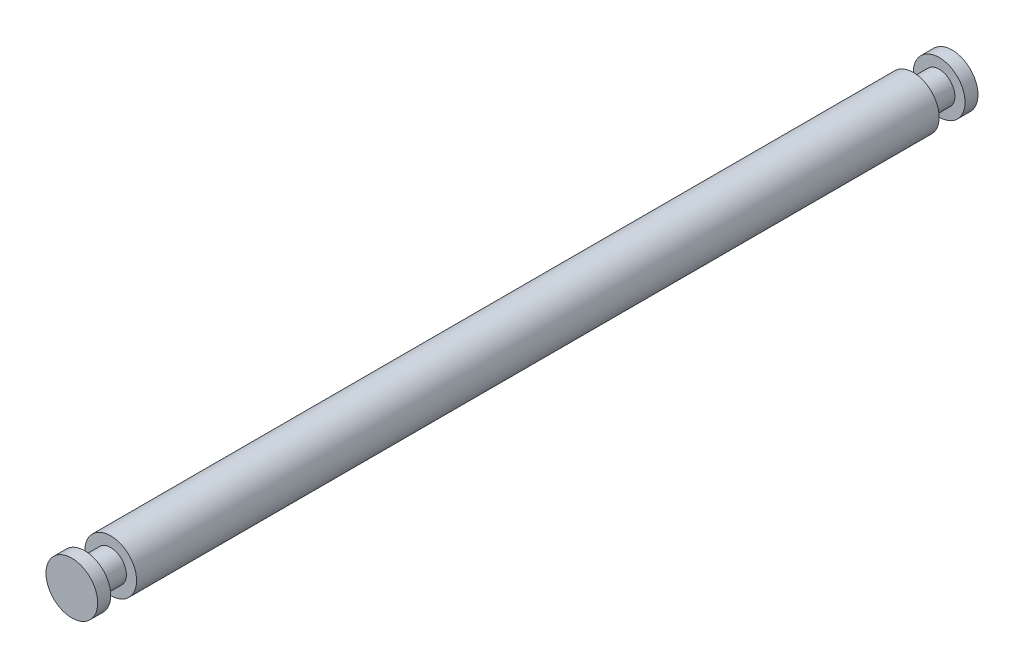
ISO-10303-21;
HEADER;
FILE_DESCRIPTION(('STEP AP214'),'2;1');
FILE_NAME('part.step','',(''),(''),'','','');
FILE_SCHEMA(('AUTOMOTIVE_DESIGN { 1 0 10303 214 1 1 1 1 }'));
ENDSEC;
DATA;
#1=APPLICATION_CONTEXT('core data for automotive mechanical design processes');
#2=APPLICATION_PROTOCOL_DEFINITION('international standard','automotive_design',2000,#1);
#3=PRODUCT_CONTEXT('',#1,'mechanical');
#4=PRODUCT('Part','Part','',(#3));
#5=PRODUCT_RELATED_PRODUCT_CATEGORY('part','',(#4));
#6=PRODUCT_DEFINITION_FORMATION('','',#4);
#7=PRODUCT_DEFINITION_CONTEXT('part definition',#1,'design');
#8=PRODUCT_DEFINITION('design','',#6,#7);
#9=PRODUCT_DEFINITION_SHAPE('','',#8);
#10=(LENGTH_UNIT() NAMED_UNIT(*) SI_UNIT(.MILLI.,.METRE.));
#11=(NAMED_UNIT(*) PLANE_ANGLE_UNIT() SI_UNIT($,.RADIAN.));
#12=(NAMED_UNIT(*) SI_UNIT($,.STERADIAN.) SOLID_ANGLE_UNIT());
#13=UNCERTAINTY_MEASURE_WITH_UNIT(LENGTH_MEASURE(1.E-05),#10,'distance_accuracy_value','');
#14=(GEOMETRIC_REPRESENTATION_CONTEXT(3) GLOBAL_UNCERTAINTY_ASSIGNED_CONTEXT((#13)) GLOBAL_UNIT_ASSIGNED_CONTEXT((#10,
#11,#12)) REPRESENTATION_CONTEXT('',''));
#15=CARTESIAN_POINT('',(0.,0.,0.));
#16=DIRECTION('',(0.,0.,1.));
#17=DIRECTION('',(1.,0.,0.));
#18=AXIS2_PLACEMENT_3D('',#15,#16,#17);
#19=CARTESIAN_POINT('',(0.,0.,0.));
#20=DIRECTION('',(0.,0.,1.));
#21=DIRECTION('',(1.,0.,0.));
#22=AXIS2_PLACEMENT_3D('',#19,#20,#21);
#23=CYLINDRICAL_SURFACE('',#22,1.27);
#24=CARTESIAN_POINT('',(0.,0.,-0.635));
#25=DIRECTION('',(0.,0.,1.));
#26=DIRECTION('',(1.,0.,0.));
#27=AXIS2_PLACEMENT_3D('',#24,#25,#26);
#28=CIRCLE('',#27,1.27);
#29=CARTESIAN_POINT('',(1.27,0.,-0.635));
#30=VERTEX_POINT('',#29);
#31=EDGE_CURVE('E43',#30,#30,#28,.T.);
#32=ORIENTED_EDGE('',*,*,#31,.T.);
#33=EDGE_LOOP('',(#32));
#34=FACE_BOUND('',#33,.T.);
#35=CARTESIAN_POINT('',(0.,0.,0.));
#36=DIRECTION('',(0.,0.,1.));
#37=DIRECTION('',(1.,0.,0.));
#38=AXIS2_PLACEMENT_3D('',#35,#36,#37);
#39=CIRCLE('',#38,1.27);
#40=CARTESIAN_POINT('',(1.27,0.,0.));
#41=VERTEX_POINT('',#40);
#42=EDGE_CURVE('E39',#41,#41,#39,.T.);
#43=ORIENTED_EDGE('',*,*,#42,.F.);
#44=EDGE_LOOP('',(#43));
#45=FACE_BOUND('',#44,.T.);
#46=ADVANCED_FACE('F32',(#34,#45),#23,.T.);
#47=CARTESIAN_POINT('',(0.,0.,0.));
#48=DIRECTION('',(0.,0.,1.));
#49=DIRECTION('',(1.,0.,0.));
#50=AXIS2_PLACEMENT_3D('',#47,#48,#49);
#51=PLANE('',#50);
#52=ORIENTED_EDGE('',*,*,#42,.T.);
#53=EDGE_LOOP('',(#52));
#54=FACE_BOUND('',#53,.T.);
#55=ADVANCED_FACE('F89',(#54),#51,.T.);
#56=CARTESIAN_POINT('',(1.27,0.,-0.635));
#57=DIRECTION('',(0.,0.,1.));
#58=DIRECTION('',(1.,0.,0.));
#59=AXIS2_PLACEMENT_3D('',#56,#57,#58);
#60=PLANE('',#59);
#61=ORIENTED_EDGE('',*,*,#31,.F.);
#62=EDGE_LOOP('',(#61));
#63=FACE_BOUND('',#62,.T.);
#64=CARTESIAN_POINT('',(0.,0.,-0.635));
#65=DIRECTION('',(0.,0.,1.));
#66=DIRECTION('',(1.,0.,0.));
#67=AXIS2_PLACEMENT_3D('',#64,#65,#66);
#68=CIRCLE('',#67,0.770587131468783);
#69=CARTESIAN_POINT('',(0.770587131468783,0.,-0.635));
#70=VERTEX_POINT('',#69);
#71=EDGE_CURVE('E47',#70,#70,#68,.T.);
#72=ORIENTED_EDGE('',*,*,#71,.T.);
#73=EDGE_LOOP('',(#72));
#74=FACE_BOUND('',#73,.T.);
#75=ADVANCED_FACE('F94',(#63,#74),#60,.F.);
#76=CARTESIAN_POINT('',(0.,0.,0.));
#77=DIRECTION('',(0.,0.,1.));
#78=DIRECTION('',(1.,0.,0.));
#79=AXIS2_PLACEMENT_3D('',#76,#77,#78);
#80=CYLINDRICAL_SURFACE('',#79,0.770587131468783);
#81=ORIENTED_EDGE('',*,*,#71,.F.);
#82=EDGE_LOOP('',(#81));
#83=FACE_BOUND('',#82,.T.);
#84=CARTESIAN_POINT('',(0.,0.,-1.905));
#85=DIRECTION('',(0.,0.,1.));
#86=DIRECTION('',(1.,0.,0.));
#87=AXIS2_PLACEMENT_3D('',#84,#85,#86);
#88=CIRCLE('',#87,0.770587131468784);
#89=CARTESIAN_POINT('',(0.770587131468784,0.,-1.905));
#90=VERTEX_POINT('',#89);
#91=EDGE_CURVE('E52',#90,#90,#88,.T.);
#92=ORIENTED_EDGE('',*,*,#91,.T.);
#93=EDGE_LOOP('',(#92));
#94=FACE_BOUND('',#93,.T.);
#95=ADVANCED_FACE('F116',(#83,#94),#80,.T.);
#96=CARTESIAN_POINT('',(0.770587131468784,0.,-1.905));
#97=DIRECTION('',(0.,0.,-1.));
#98=DIRECTION('',(-1.,0.,0.));
#99=AXIS2_PLACEMENT_3D('',#96,#97,#98);
#100=PLANE('',#99);
#101=ORIENTED_EDGE('',*,*,#91,.F.);
#102=EDGE_LOOP('',(#101));
#103=FACE_BOUND('',#102,.T.);
#104=CARTESIAN_POINT('',(0.,0.,-1.905));
#105=DIRECTION('',(0.,0.,1.));
#106=DIRECTION('',(1.,0.,0.));
#107=AXIS2_PLACEMENT_3D('',#104,#105,#106);
#108=CIRCLE('',#107,1.27);
#109=CARTESIAN_POINT('',(1.27,0.,-1.905));
#110=VERTEX_POINT('',#109);
#111=EDGE_CURVE('E55',#110,#110,#108,.T.);
#112=ORIENTED_EDGE('',*,*,#111,.T.);
#113=EDGE_LOOP('',(#112));
#114=FACE_BOUND('',#113,.T.);
#115=ADVANCED_FACE('F98',(#103,#114),#100,.F.);
#116=CARTESIAN_POINT('',(0.,0.,-41.275));
#117=DIRECTION('',(0.,0.,1.));
#118=DIRECTION('',(1.,0.,0.));
#119=AXIS2_PLACEMENT_3D('',#116,#117,#118);
#120=CIRCLE('',#119,1.27);
#121=CARTESIAN_POINT('',(1.27,0.,-41.275));
#122=VERTEX_POINT('',#121);
#123=EDGE_CURVE('E67',#122,#122,#120,.T.);
#124=ORIENTED_EDGE('',*,*,#123,.T.);
#125=EDGE_LOOP('',(#124));
#126=FACE_BOUND('',#125,.T.);
#127=ORIENTED_EDGE('',*,*,#111,.F.);
#128=EDGE_LOOP('',(#127));
#129=FACE_BOUND('',#128,.T.);
#130=ADVANCED_FACE('F71',(#126,#129),#23,.T.);
#131=CARTESIAN_POINT('',(1.27,0.,-42.545));
#132=DIRECTION('',(0.,0.,-1.));
#133=DIRECTION('',(1.,0.,0.));
#134=AXIS2_PLACEMENT_3D('',#131,#132,#133);
#135=PLANE('',#134);
#136=CARTESIAN_POINT('',(0.,0.,-42.545));
#137=DIRECTION('',(0.,0.,1.));
#138=DIRECTION('',(1.,0.,0.));
#139=AXIS2_PLACEMENT_3D('',#136,#137,#138);
#140=CIRCLE('',#139,1.27);
#141=CARTESIAN_POINT('',(1.27,0.,-42.545));
#142=VERTEX_POINT('',#141);
#143=EDGE_CURVE('E58',#142,#142,#140,.T.);
#144=ORIENTED_EDGE('',*,*,#143,.T.);
#145=EDGE_LOOP('',(#144));
#146=FACE_BOUND('',#145,.T.);
#147=CARTESIAN_POINT('',(0.,0.,-42.545));
#148=DIRECTION('',(0.,0.,1.));
#149=DIRECTION('',(1.,0.,0.));
#150=AXIS2_PLACEMENT_3D('',#147,#148,#149);
#151=CIRCLE('',#150,0.770587131468783);
#152=CARTESIAN_POINT('',(0.770587131468783,0.,-42.545));
#153=VERTEX_POINT('',#152);
#154=EDGE_CURVE('E61',#153,#153,#151,.T.);
#155=ORIENTED_EDGE('',*,*,#154,.F.);
#156=EDGE_LOOP('',(#155));
#157=FACE_BOUND('',#156,.T.);
#158=ADVANCED_FACE('F85',(#146,#157),#135,.F.);
#159=CARTESIAN_POINT('',(0.,0.,-43.18));
#160=DIRECTION('',(0.,0.,-1.));
#161=DIRECTION('',(1.,0.,0.));
#162=AXIS2_PLACEMENT_3D('',#159,#160,#161);
#163=CYLINDRICAL_SURFACE('',#162,0.770587131468783);
#164=ORIENTED_EDGE('',*,*,#154,.T.);
#165=EDGE_LOOP('',(#164));
#166=FACE_BOUND('',#165,.T.);
#167=CARTESIAN_POINT('',(0.,0.,-41.275));
#168=DIRECTION('',(0.,0.,1.));
#169=DIRECTION('',(1.,0.,0.));
#170=AXIS2_PLACEMENT_3D('',#167,#168,#169);
#171=CIRCLE('',#170,0.770587131468784);
#172=CARTESIAN_POINT('',(0.770587131468784,0.,-41.275));
#173=VERTEX_POINT('',#172);
#174=EDGE_CURVE('E64',#173,#173,#171,.T.);
#175=ORIENTED_EDGE('',*,*,#174,.F.);
#176=EDGE_LOOP('',(#175));
#177=FACE_BOUND('',#176,.T.);
#178=ADVANCED_FACE('F76',(#166,#177),#163,.T.);
#179=CARTESIAN_POINT('',(0.770587131468784,0.,-41.275));
#180=DIRECTION('',(0.,0.,1.));
#181=DIRECTION('',(-1.,0.,0.));
#182=AXIS2_PLACEMENT_3D('',#179,#180,#181);
#183=PLANE('',#182);
#184=ORIENTED_EDGE('',*,*,#174,.T.);
#185=EDGE_LOOP('',(#184));
#186=FACE_BOUND('',#185,.T.);
#187=ORIENTED_EDGE('',*,*,#123,.F.);
#188=EDGE_LOOP('',(#187));
#189=FACE_BOUND('',#188,.T.);
#190=ADVANCED_FACE('F74',(#186,#189),#183,.F.);
#191=CARTESIAN_POINT('',(0.,0.,-43.18));
#192=DIRECTION('',(0.,0.,-1.));
#193=DIRECTION('',(-1.,0.,0.));
#194=AXIS2_PLACEMENT_3D('',#191,#192,#193);
#195=PLANE('',#194);
#196=CARTESIAN_POINT('',(0.,0.,-43.18));
#197=DIRECTION('',(0.,0.,1.));
#198=DIRECTION('',(1.,0.,0.));
#199=AXIS2_PLACEMENT_3D('',#196,#197,#198);
#200=CIRCLE('',#199,1.27);
#201=CARTESIAN_POINT('',(1.27,0.,-43.18));
#202=VERTEX_POINT('',#201);
#203=EDGE_CURVE('E10',#202,#202,#200,.T.);
#204=ORIENTED_EDGE('',*,*,#203,.F.);
#205=EDGE_LOOP('',(#204));
#206=FACE_BOUND('',#205,.T.);
#207=ADVANCED_FACE('F34',(#206),#195,.T.);
#208=ORIENTED_EDGE('',*,*,#143,.F.);
#209=EDGE_LOOP('',(#208));
#210=FACE_BOUND('',#209,.T.);
#211=ORIENTED_EDGE('',*,*,#203,.T.);
#212=EDGE_LOOP('',(#211));
#213=FACE_BOUND('',#212,.T.);
#214=ADVANCED_FACE('F83',(#210,#213),#23,.T.);
#215=CLOSED_SHELL('',(#46,#55,#75,#95,#115,#130,#158,#178,#190,#207,#214));
#216=MANIFOLD_SOLID_BREP('B2',#215);
#217=ADVANCED_BREP_SHAPE_REPRESENTATION('',(#18,#216),#14);
#218=SHAPE_DEFINITION_REPRESENTATION(#9,#217);
ENDSEC;
END-ISO-10303-21;
